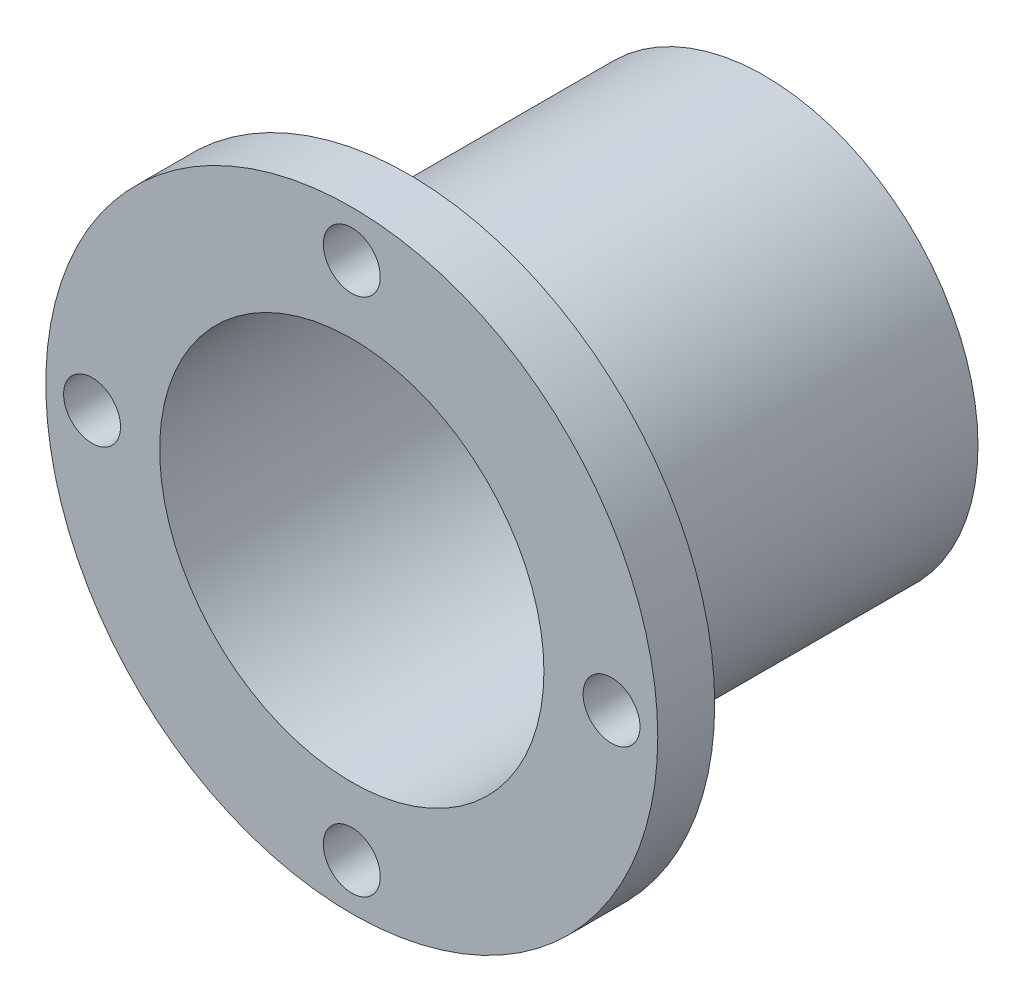
ISO-10303-21;
HEADER;
FILE_DESCRIPTION(('STEP AP214'),'2;1');
FILE_NAME('part.step','',(''),(''),'','','');
FILE_SCHEMA(('AUTOMOTIVE_DESIGN { 1 0 10303 214 1 1 1 1 }'));
ENDSEC;
DATA;
#1=APPLICATION_CONTEXT('core data for automotive mechanical design processes');
#2=APPLICATION_PROTOCOL_DEFINITION('international standard','automotive_design',2000,#1);
#3=PRODUCT_CONTEXT('',#1,'mechanical');
#4=PRODUCT('Part','Part','',(#3));
#5=PRODUCT_RELATED_PRODUCT_CATEGORY('part','',(#4));
#6=PRODUCT_DEFINITION_FORMATION('','',#4);
#7=PRODUCT_DEFINITION_CONTEXT('part definition',#1,'design');
#8=PRODUCT_DEFINITION('design','',#6,#7);
#9=PRODUCT_DEFINITION_SHAPE('','',#8);
#10=(LENGTH_UNIT() NAMED_UNIT(*) SI_UNIT(.MILLI.,.METRE.));
#11=(NAMED_UNIT(*) PLANE_ANGLE_UNIT() SI_UNIT($,.RADIAN.));
#12=(NAMED_UNIT(*) SI_UNIT($,.STERADIAN.) SOLID_ANGLE_UNIT());
#13=UNCERTAINTY_MEASURE_WITH_UNIT(LENGTH_MEASURE(1.E-05),#10,'distance_accuracy_value','');
#14=(GEOMETRIC_REPRESENTATION_CONTEXT(3) GLOBAL_UNCERTAINTY_ASSIGNED_CONTEXT((#13)) GLOBAL_UNIT_ASSIGNED_CONTEXT((#10,
#11,#12)) REPRESENTATION_CONTEXT('',''));
#15=CARTESIAN_POINT('',(0.,0.,0.));
#16=DIRECTION('',(0.,0.,1.));
#17=DIRECTION('',(1.,0.,0.));
#18=AXIS2_PLACEMENT_3D('',#15,#16,#17);
#19=CARTESIAN_POINT('',(0.,0.,0.));
#20=DIRECTION('',(0.,0.,1.));
#21=DIRECTION('',(1.,0.,0.));
#22=AXIS2_PLACEMENT_3D('',#19,#20,#21);
#23=PLANE('',#22);
#24=CARTESIAN_POINT('',(0.,0.,0.));
#25=DIRECTION('',(0.,0.,1.));
#26=DIRECTION('',(1.,0.,0.));
#27=AXIS2_PLACEMENT_3D('',#24,#25,#26);
#28=CIRCLE('',#27,15.);
#29=CARTESIAN_POINT('',(15.,0.,0.));
#30=VERTEX_POINT('',#29);
#31=EDGE_CURVE('E46',#30,#30,#28,.T.);
#32=ORIENTED_EDGE('',*,*,#31,.F.);
#33=EDGE_LOOP('',(#32));
#34=FACE_BOUND('',#33,.T.);
#35=CARTESIAN_POINT('',(0.,0.,0.));
#36=DIRECTION('',(0.,0.,1.));
#37=DIRECTION('',(1.,0.,0.));
#38=AXIS2_PLACEMENT_3D('',#35,#36,#37);
#39=CIRCLE('',#38,13.5);
#40=CARTESIAN_POINT('',(13.5,0.,0.));
#41=VERTEX_POINT('',#40);
#42=EDGE_CURVE('E50',#41,#41,#39,.T.);
#43=ORIENTED_EDGE('',*,*,#42,.T.);
#44=EDGE_LOOP('',(#43));
#45=FACE_BOUND('',#44,.T.);
#46=ADVANCED_FACE('F35',(#34,#45),#23,.F.);
#47=CARTESIAN_POINT('',(0.,0.,25.));
#48=DIRECTION('',(0.,0.,-1.));
#49=DIRECTION('',(-1.,0.,0.));
#50=AXIS2_PLACEMENT_3D('',#47,#48,#49);
#51=CYLINDRICAL_SURFACE('',#50,15.);
#52=CARTESIAN_POINT('',(0.,0.,24.));
#53=DIRECTION('',(0.,0.,1.));
#54=DIRECTION('',(1.,0.,0.));
#55=AXIS2_PLACEMENT_3D('',#52,#53,#54);
#56=CIRCLE('',#55,15.);
#57=CARTESIAN_POINT('',(15.,0.,24.));
#58=VERTEX_POINT('',#57);
#59=EDGE_CURVE('E10',#58,#58,#56,.F.);
#60=ORIENTED_EDGE('',*,*,#59,.T.);
#61=EDGE_LOOP('',(#60));
#62=FACE_BOUND('',#61,.T.);
#63=ORIENTED_EDGE('',*,*,#31,.T.);
#64=EDGE_LOOP('',(#63));
#65=FACE_BOUND('',#64,.T.);
#66=ADVANCED_FACE('F104',(#62,#65),#51,.T.);
#67=CARTESIAN_POINT('',(0.,0.,25.));
#68=DIRECTION('',(0.,0.,-1.));
#69=DIRECTION('',(-1.,0.,0.));
#70=AXIS2_PLACEMENT_3D('',#67,#68,#69);
#71=CYLINDRICAL_SURFACE('',#70,13.5);
#72=ORIENTED_EDGE('',*,*,#42,.F.);
#73=EDGE_LOOP('',(#72));
#74=FACE_BOUND('',#73,.T.);
#75=CARTESIAN_POINT('',(0.,0.,29.));
#76=DIRECTION('',(0.,0.,1.));
#77=DIRECTION('',(1.,0.,0.));
#78=AXIS2_PLACEMENT_3D('',#75,#76,#77);
#79=CIRCLE('',#78,13.5);
#80=CARTESIAN_POINT('',(13.5,0.,29.));
#81=VERTEX_POINT('',#80);
#82=EDGE_CURVE('E59',#81,#81,#79,.T.);
#83=ORIENTED_EDGE('',*,*,#82,.T.);
#84=EDGE_LOOP('',(#83));
#85=FACE_BOUND('',#84,.T.);
#86=ADVANCED_FACE('F95',(#74,#85),#71,.F.);
#87=CARTESIAN_POINT('',(0.,0.,29.));
#88=DIRECTION('',(0.,0.,1.));
#89=DIRECTION('',(1.,0.,0.));
#90=AXIS2_PLACEMENT_3D('',#87,#88,#89);
#91=PLANE('',#90);
#92=CARTESIAN_POINT('',(1.07295262309028E-12,-18.25,29.));
#93=DIRECTION('',(0.,0.,1.));
#94=DIRECTION('',(1.,0.,0.));
#95=AXIS2_PLACEMENT_3D('',#92,#93,#94);
#96=CIRCLE('',#95,2.);
#97=CARTESIAN_POINT('',(2.00000000000107,-18.25,29.));
#98=VERTEX_POINT('',#97);
#99=EDGE_CURVE('E74',#98,#98,#96,.T.);
#100=ORIENTED_EDGE('',*,*,#99,.F.);
#101=EDGE_LOOP('',(#100));
#102=FACE_BOUND('',#101,.T.);
#103=CARTESIAN_POINT('',(0.,18.25,29.));
#104=DIRECTION('',(0.,0.,1.));
#105=DIRECTION('',(1.,0.,0.));
#106=AXIS2_PLACEMENT_3D('',#103,#104,#105);
#107=CIRCLE('',#106,2.);
#108=CARTESIAN_POINT('',(2.,18.25,29.));
#109=VERTEX_POINT('',#108);
#110=EDGE_CURVE('E64',#109,#109,#107,.T.);
#111=ORIENTED_EDGE('',*,*,#110,.F.);
#112=EDGE_LOOP('',(#111));
#113=FACE_BOUND('',#112,.T.);
#114=CARTESIAN_POINT('',(0.,0.,29.));
#115=DIRECTION('',(0.,0.,1.));
#116=DIRECTION('',(1.,0.,0.));
#117=AXIS2_PLACEMENT_3D('',#114,#115,#116);
#118=CIRCLE('',#117,21.5);
#119=CARTESIAN_POINT('',(21.5,0.,29.));
#120=VERTEX_POINT('',#119);
#121=EDGE_CURVE('E55',#120,#120,#118,.T.);
#122=ORIENTED_EDGE('',*,*,#121,.T.);
#123=EDGE_LOOP('',(#122));
#124=FACE_BOUND('',#123,.T.);
#125=ORIENTED_EDGE('',*,*,#82,.F.);
#126=EDGE_LOOP('',(#125));
#127=FACE_BOUND('',#126,.T.);
#128=CARTESIAN_POINT('',(18.2500000000005,5.36476311545138E-13,29.));
#129=DIRECTION('',(0.,0.,1.));
#130=DIRECTION('',(1.,0.,0.));
#131=AXIS2_PLACEMENT_3D('',#128,#129,#130);
#132=CIRCLE('',#131,2.);
#133=CARTESIAN_POINT('',(20.2500000000005,5.36476311545138E-13,29.));
#134=VERTEX_POINT('',#133);
#135=EDGE_CURVE('E68',#134,#134,#132,.T.);
#136=ORIENTED_EDGE('',*,*,#135,.F.);
#137=EDGE_LOOP('',(#136));
#138=FACE_BOUND('',#137,.T.);
#139=CARTESIAN_POINT('',(-18.2499999999995,-5.38711291953582E-13,29.));
#140=DIRECTION('',(0.,0.,1.));
#141=DIRECTION('',(1.,0.,0.));
#142=AXIS2_PLACEMENT_3D('',#139,#140,#141);
#143=CIRCLE('',#142,2.);
#144=CARTESIAN_POINT('',(-16.2499999999995,-5.38711291953582E-13,29.));
#145=VERTEX_POINT('',#144);
#146=EDGE_CURVE('E80',#145,#145,#143,.T.);
#147=ORIENTED_EDGE('',*,*,#146,.F.);
#148=EDGE_LOOP('',(#147));
#149=FACE_BOUND('',#148,.T.);
#150=ADVANCED_FACE('F92',(#102,#113,#124,#127,#138,#149),#91,.T.);
#151=CARTESIAN_POINT('',(0.,0.,25.));
#152=DIRECTION('',(0.,0.,1.));
#153=DIRECTION('',(1.,0.,0.));
#154=AXIS2_PLACEMENT_3D('',#151,#152,#153);
#155=PLANE('',#154);
#156=CARTESIAN_POINT('',(0.,0.,25.));
#157=DIRECTION('',(0.,0.,1.));
#158=DIRECTION('',(1.,0.,0.));
#159=AXIS2_PLACEMENT_3D('',#156,#157,#158);
#160=CIRCLE('',#159,16.);
#161=CARTESIAN_POINT('',(16.,0.,25.));
#162=VERTEX_POINT('',#161);
#163=EDGE_CURVE('E42',#162,#162,#160,.T.);
#164=ORIENTED_EDGE('',*,*,#163,.T.);
#165=EDGE_LOOP('',(#164));
#166=FACE_BOUND('',#165,.T.);
#167=CARTESIAN_POINT('',(0.,0.,25.));
#168=DIRECTION('',(0.,0.,1.));
#169=DIRECTION('',(1.,0.,0.));
#170=AXIS2_PLACEMENT_3D('',#167,#168,#169);
#171=CIRCLE('',#170,21.5);
#172=CARTESIAN_POINT('',(21.5,0.,25.));
#173=VERTEX_POINT('',#172);
#174=EDGE_CURVE('E56',#173,#173,#171,.T.);
#175=ORIENTED_EDGE('',*,*,#174,.F.);
#176=EDGE_LOOP('',(#175));
#177=FACE_BOUND('',#176,.T.);
#178=CARTESIAN_POINT('',(0.,18.25,25.));
#179=DIRECTION('',(0.,0.,1.));
#180=DIRECTION('',(1.,0.,0.));
#181=AXIS2_PLACEMENT_3D('',#178,#179,#180);
#182=CIRCLE('',#181,2.);
#183=CARTESIAN_POINT('',(2.,18.25,25.));
#184=VERTEX_POINT('',#183);
#185=EDGE_CURVE('E65',#184,#184,#182,.T.);
#186=ORIENTED_EDGE('',*,*,#185,.T.);
#187=EDGE_LOOP('',(#186));
#188=FACE_BOUND('',#187,.T.);
#189=CARTESIAN_POINT('',(18.2500000000005,5.36476311545138E-13,25.));
#190=DIRECTION('',(0.,0.,1.));
#191=DIRECTION('',(1.,0.,0.));
#192=AXIS2_PLACEMENT_3D('',#189,#190,#191);
#193=CIRCLE('',#192,2.);
#194=CARTESIAN_POINT('',(20.2500000000005,5.36476311545138E-13,25.));
#195=VERTEX_POINT('',#194);
#196=EDGE_CURVE('E71',#195,#195,#193,.T.);
#197=ORIENTED_EDGE('',*,*,#196,.T.);
#198=EDGE_LOOP('',(#197));
#199=FACE_BOUND('',#198,.T.);
#200=CARTESIAN_POINT('',(1.07295262309028E-12,-18.25,25.));
#201=DIRECTION('',(0.,0.,1.));
#202=DIRECTION('',(1.,0.,0.));
#203=AXIS2_PLACEMENT_3D('',#200,#201,#202);
#204=CIRCLE('',#203,2.);
#205=CARTESIAN_POINT('',(2.00000000000107,-18.25,25.));
#206=VERTEX_POINT('',#205);
#207=EDGE_CURVE('E77',#206,#206,#204,.T.);
#208=ORIENTED_EDGE('',*,*,#207,.T.);
#209=EDGE_LOOP('',(#208));
#210=FACE_BOUND('',#209,.T.);
#211=CARTESIAN_POINT('',(-18.2499999999995,-5.38711291953582E-13,25.));
#212=DIRECTION('',(0.,0.,1.));
#213=DIRECTION('',(1.,0.,0.));
#214=AXIS2_PLACEMENT_3D('',#211,#212,#213);
#215=CIRCLE('',#214,2.);
#216=CARTESIAN_POINT('',(-16.2499999999995,-5.38711291953582E-13,25.));
#217=VERTEX_POINT('',#216);
#218=EDGE_CURVE('E83',#217,#217,#215,.T.);
#219=ORIENTED_EDGE('',*,*,#218,.T.);
#220=EDGE_LOOP('',(#219));
#221=FACE_BOUND('',#220,.T.);
#222=ADVANCED_FACE('F94',(#166,#177,#188,#199,#210,#221),#155,.F.);
#223=CARTESIAN_POINT('',(0.,0.,29.));
#224=DIRECTION('',(0.,0.,-1.));
#225=DIRECTION('',(-1.,0.,0.));
#226=AXIS2_PLACEMENT_3D('',#223,#224,#225);
#227=CYLINDRICAL_SURFACE('',#226,21.5);
#228=ORIENTED_EDGE('',*,*,#121,.F.);
#229=EDGE_LOOP('',(#228));
#230=FACE_BOUND('',#229,.T.);
#231=ORIENTED_EDGE('',*,*,#174,.T.);
#232=EDGE_LOOP('',(#231));
#233=FACE_BOUND('',#232,.T.);
#234=ADVANCED_FACE('F102',(#230,#233),#227,.T.);
#235=CARTESIAN_POINT('',(0.,18.25,29.));
#236=DIRECTION('',(0.,0.,-1.));
#237=DIRECTION('',(-1.,0.,0.));
#238=AXIS2_PLACEMENT_3D('',#235,#236,#237);
#239=CYLINDRICAL_SURFACE('',#238,2.);
#240=ORIENTED_EDGE('',*,*,#110,.T.);
#241=EDGE_LOOP('',(#240));
#242=FACE_BOUND('',#241,.T.);
#243=ORIENTED_EDGE('',*,*,#185,.F.);
#244=EDGE_LOOP('',(#243));
#245=FACE_BOUND('',#244,.T.);
#246=ADVANCED_FACE('F120',(#242,#245),#239,.F.);
#247=CARTESIAN_POINT('',(18.2500000000005,5.36476311545138E-13,29.));
#248=DIRECTION('',(0.,0.,-1.));
#249=DIRECTION('',(-1.,0.,0.));
#250=AXIS2_PLACEMENT_3D('',#247,#248,#249);
#251=CYLINDRICAL_SURFACE('',#250,2.);
#252=ORIENTED_EDGE('',*,*,#135,.T.);
#253=EDGE_LOOP('',(#252));
#254=FACE_BOUND('',#253,.T.);
#255=ORIENTED_EDGE('',*,*,#196,.F.);
#256=EDGE_LOOP('',(#255));
#257=FACE_BOUND('',#256,.T.);
#258=ADVANCED_FACE('F125',(#254,#257),#251,.F.);
#259=CARTESIAN_POINT('',(1.07295262309028E-12,-18.25,29.));
#260=DIRECTION('',(0.,0.,-1.));
#261=DIRECTION('',(-1.,0.,0.));
#262=AXIS2_PLACEMENT_3D('',#259,#260,#261);
#263=CYLINDRICAL_SURFACE('',#262,2.);
#264=ORIENTED_EDGE('',*,*,#99,.T.);
#265=EDGE_LOOP('',(#264));
#266=FACE_BOUND('',#265,.T.);
#267=ORIENTED_EDGE('',*,*,#207,.F.);
#268=EDGE_LOOP('',(#267));
#269=FACE_BOUND('',#268,.T.);
#270=ADVANCED_FACE('F140',(#266,#269),#263,.F.);
#271=CARTESIAN_POINT('',(-18.2499999999995,-5.38711291953582E-13,29.));
#272=DIRECTION('',(0.,0.,-1.));
#273=DIRECTION('',(-1.,0.,0.));
#274=AXIS2_PLACEMENT_3D('',#271,#272,#273);
#275=CYLINDRICAL_SURFACE('',#274,2.);
#276=ORIENTED_EDGE('',*,*,#146,.T.);
#277=EDGE_LOOP('',(#276));
#278=FACE_BOUND('',#277,.T.);
#279=ORIENTED_EDGE('',*,*,#218,.F.);
#280=EDGE_LOOP('',(#279));
#281=FACE_BOUND('',#280,.T.);
#282=ADVANCED_FACE('F89',(#278,#281),#275,.F.);
#283=CARTESIAN_POINT('',(0.,0.,24.));
#284=DIRECTION('',(0.,0.,1.));
#285=DIRECTION('',(1.,0.,0.));
#286=AXIS2_PLACEMENT_3D('',#283,#284,#285);
#287=TOROIDAL_SURFACE('',#286,16.,1.);
#288=ORIENTED_EDGE('',*,*,#59,.F.);
#289=EDGE_LOOP('',(#288));
#290=FACE_BOUND('',#289,.T.);
#291=ORIENTED_EDGE('',*,*,#163,.F.);
#292=EDGE_LOOP('',(#291));
#293=FACE_BOUND('',#292,.T.);
#294=ADVANCED_FACE('F37',(#290,#293),#287,.F.);
#295=CLOSED_SHELL('',(#46,#66,#86,#150,#222,#234,#246,#258,#270,#282,#294));
#296=MANIFOLD_SOLID_BREP('B2',#295);
#297=ADVANCED_BREP_SHAPE_REPRESENTATION('',(#18,#296),#14);
#298=SHAPE_DEFINITION_REPRESENTATION(#9,#297);
ENDSEC;
END-ISO-10303-21;
